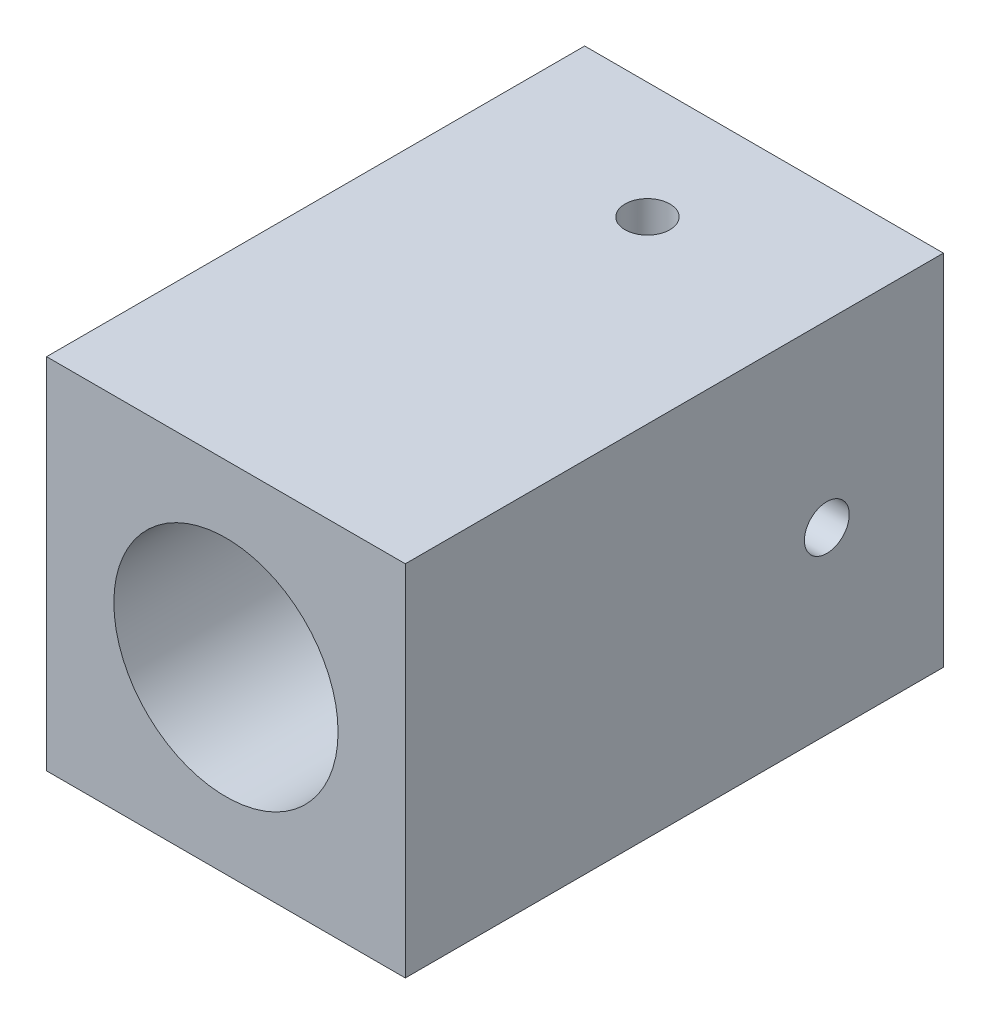
ISO-10303-21;
HEADER;
FILE_DESCRIPTION(('STEP AP214'),'2;1');
FILE_NAME('part.step','',(''),(''),'','','');
FILE_SCHEMA(('AUTOMOTIVE_DESIGN { 1 0 10303 214 1 1 1 1 }'));
ENDSEC;
DATA;
#1=APPLICATION_CONTEXT('core data for automotive mechanical design processes');
#2=APPLICATION_PROTOCOL_DEFINITION('international standard','automotive_design',2000,#1);
#3=PRODUCT_CONTEXT('',#1,'mechanical');
#4=PRODUCT('Part','Part','',(#3));
#5=PRODUCT_RELATED_PRODUCT_CATEGORY('part','',(#4));
#6=PRODUCT_DEFINITION_FORMATION('','',#4);
#7=PRODUCT_DEFINITION_CONTEXT('part definition',#1,'design');
#8=PRODUCT_DEFINITION('design','',#6,#7);
#9=PRODUCT_DEFINITION_SHAPE('','',#8);
#10=(LENGTH_UNIT() NAMED_UNIT(*) SI_UNIT(.MILLI.,.METRE.));
#11=(NAMED_UNIT(*) PLANE_ANGLE_UNIT() SI_UNIT($,.RADIAN.));
#12=(NAMED_UNIT(*) SI_UNIT($,.STERADIAN.) SOLID_ANGLE_UNIT());
#13=UNCERTAINTY_MEASURE_WITH_UNIT(LENGTH_MEASURE(1.E-05),#10,'distance_accuracy_value','');
#14=(GEOMETRIC_REPRESENTATION_CONTEXT(3) GLOBAL_UNCERTAINTY_ASSIGNED_CONTEXT((#13)) GLOBAL_UNIT_ASSIGNED_CONTEXT((#10,
#11,#12)) REPRESENTATION_CONTEXT('',''));
#15=CARTESIAN_POINT('',(0.,0.,0.));
#16=DIRECTION('',(0.,0.,1.));
#17=DIRECTION('',(1.,0.,0.));
#18=AXIS2_PLACEMENT_3D('',#15,#16,#17);
#19=CARTESIAN_POINT('',(20.,-20.,60.));
#20=DIRECTION('',(-1.,0.,0.));
#21=DIRECTION('',(0.,0.,1.));
#22=AXIS2_PLACEMENT_3D('',#19,#20,#21);
#23=PLANE('',#22);
#24=CARTESIAN_POINT('',(20.,0.,13.));
#25=DIRECTION('',(1.,0.,0.));
#26=DIRECTION('',(0.,0.,-1.));
#27=AXIS2_PLACEMENT_3D('',#24,#25,#26);
#28=CIRCLE('',#27,2.5);
#29=CARTESIAN_POINT('',(20.,0.,10.5));
#30=VERTEX_POINT('',#29);
#31=EDGE_CURVE('E141',#30,#30,#28,.T.);
#32=ORIENTED_EDGE('',*,*,#31,.F.);
#33=EDGE_LOOP('',(#32));
#34=FACE_BOUND('',#33,.T.);
#35=DIRECTION('',(0.,1.,0.));
#36=VECTOR('',#35,1.);
#37=CARTESIAN_POINT('',(20.,-20.,0.));
#38=LINE('',#37,#36);
#39=CARTESIAN_POINT('',(20.,-20.,0.));
#40=VERTEX_POINT('',#39);
#41=CARTESIAN_POINT('',(20.,20.,0.));
#42=VERTEX_POINT('',#41);
#43=EDGE_CURVE('E112',#40,#42,#38,.T.);
#44=ORIENTED_EDGE('',*,*,#43,.T.);
#45=DIRECTION('',(0.,0.,-1.));
#46=VECTOR('',#45,1.);
#47=CARTESIAN_POINT('',(20.,20.,60.));
#48=LINE('',#47,#46);
#49=CARTESIAN_POINT('',(20.,20.,60.));
#50=VERTEX_POINT('',#49);
#51=EDGE_CURVE('E11',#50,#42,#48,.T.);
#52=ORIENTED_EDGE('',*,*,#51,.F.);
#53=DIRECTION('',(0.,1.,0.));
#54=VECTOR('',#53,1.);
#55=CARTESIAN_POINT('',(20.,-20.,60.));
#56=LINE('',#55,#54);
#57=CARTESIAN_POINT('',(20.,-20.,60.));
#58=VERTEX_POINT('',#57);
#59=EDGE_CURVE('E96',#58,#50,#56,.T.);
#60=ORIENTED_EDGE('',*,*,#59,.F.);
#61=DIRECTION('',(0.,0.,-1.));
#62=VECTOR('',#61,1.);
#63=CARTESIAN_POINT('',(20.,-20.,60.));
#64=LINE('',#63,#62);
#65=EDGE_CURVE('E108',#58,#40,#64,.T.);
#66=ORIENTED_EDGE('',*,*,#65,.T.);
#67=EDGE_LOOP('',(#44,#52,#60,#66));
#68=FACE_BOUND('',#67,.T.);
#69=ADVANCED_FACE('F44',(#34,#68),#23,.F.);
#70=CARTESIAN_POINT('',(-20.,20.,60.));
#71=DIRECTION('',(0.,-1.,0.));
#72=DIRECTION('',(0.,0.,-1.));
#73=AXIS2_PLACEMENT_3D('',#70,#71,#72);
#74=PLANE('',#73);
#75=CARTESIAN_POINT('',(0.,20.,13.));
#76=DIRECTION('',(0.,-1.,0.));
#77=DIRECTION('',(0.,0.,-1.));
#78=AXIS2_PLACEMENT_3D('',#75,#76,#77);
#79=CIRCLE('',#78,2.5);
#80=CARTESIAN_POINT('',(0.,20.,10.5));
#81=VERTEX_POINT('',#80);
#82=EDGE_CURVE('E149',#81,#81,#79,.T.);
#83=ORIENTED_EDGE('',*,*,#82,.T.);
#84=EDGE_LOOP('',(#83));
#85=FACE_BOUND('',#84,.T.);
#86=DIRECTION('',(-1.,0.,0.));
#87=VECTOR('',#86,1.);
#88=CARTESIAN_POINT('',(-20.,20.,0.));
#89=LINE('',#88,#87);
#90=CARTESIAN_POINT('',(-20.,20.,0.));
#91=VERTEX_POINT('',#90);
#92=EDGE_CURVE('E101',#42,#91,#89,.T.);
#93=ORIENTED_EDGE('',*,*,#92,.T.);
#94=DIRECTION('',(0.,0.,-1.));
#95=VECTOR('',#94,1.);
#96=CARTESIAN_POINT('',(-20.,20.,60.));
#97=LINE('',#96,#95);
#98=CARTESIAN_POINT('',(-20.,20.,60.));
#99=VERTEX_POINT('',#98);
#100=EDGE_CURVE('E53',#99,#91,#97,.T.);
#101=ORIENTED_EDGE('',*,*,#100,.F.);
#102=DIRECTION('',(-1.,0.,0.));
#103=VECTOR('',#102,1.);
#104=CARTESIAN_POINT('',(-20.,20.,60.));
#105=LINE('',#104,#103);
#106=EDGE_CURVE('E91',#50,#99,#105,.T.);
#107=ORIENTED_EDGE('',*,*,#106,.F.);
#108=ORIENTED_EDGE('',*,*,#51,.T.);
#109=EDGE_LOOP('',(#93,#101,#107,#108));
#110=FACE_BOUND('',#109,.T.);
#111=ADVANCED_FACE('F100',(#85,#110),#74,.F.);
#112=CARTESIAN_POINT('',(-20.,-20.,60.));
#113=DIRECTION('',(1.,0.,0.));
#114=DIRECTION('',(0.,0.,-1.));
#115=AXIS2_PLACEMENT_3D('',#112,#113,#114);
#116=PLANE('',#115);
#117=CARTESIAN_POINT('',(-20.,0.,13.));
#118=DIRECTION('',(1.,0.,0.));
#119=DIRECTION('',(0.,0.,-1.));
#120=AXIS2_PLACEMENT_3D('',#117,#118,#119);
#121=CIRCLE('',#120,2.5);
#122=CARTESIAN_POINT('',(-20.,0.,10.5));
#123=VERTEX_POINT('',#122);
#124=EDGE_CURVE('E157',#123,#123,#121,.T.);
#125=ORIENTED_EDGE('',*,*,#124,.T.);
#126=EDGE_LOOP('',(#125));
#127=FACE_BOUND('',#126,.T.);
#128=DIRECTION('',(0.,-1.,0.));
#129=VECTOR('',#128,1.);
#130=CARTESIAN_POINT('',(-20.,-20.,0.));
#131=LINE('',#130,#129);
#132=CARTESIAN_POINT('',(-20.,-20.,0.));
#133=VERTEX_POINT('',#132);
#134=EDGE_CURVE('E78',#91,#133,#131,.T.);
#135=ORIENTED_EDGE('',*,*,#134,.T.);
#136=DIRECTION('',(0.,0.,-1.));
#137=VECTOR('',#136,1.);
#138=CARTESIAN_POINT('',(-20.,-20.,60.));
#139=LINE('',#138,#137);
#140=CARTESIAN_POINT('',(-20.,-20.,60.));
#141=VERTEX_POINT('',#140);
#142=EDGE_CURVE('E103',#141,#133,#139,.T.);
#143=ORIENTED_EDGE('',*,*,#142,.F.);
#144=DIRECTION('',(0.,-1.,0.));
#145=VECTOR('',#144,1.);
#146=CARTESIAN_POINT('',(-20.,-20.,60.));
#147=LINE('',#146,#145);
#148=EDGE_CURVE('E94',#99,#141,#147,.T.);
#149=ORIENTED_EDGE('',*,*,#148,.F.);
#150=ORIENTED_EDGE('',*,*,#100,.T.);
#151=EDGE_LOOP('',(#135,#143,#149,#150));
#152=FACE_BOUND('',#151,.T.);
#153=ADVANCED_FACE('F104',(#127,#152),#116,.F.);
#154=CARTESIAN_POINT('',(-20.,-20.,60.));
#155=DIRECTION('',(0.,1.,0.));
#156=DIRECTION('',(0.,0.,1.));
#157=AXIS2_PLACEMENT_3D('',#154,#155,#156);
#158=PLANE('',#157);
#159=CARTESIAN_POINT('',(0.,-20.,13.));
#160=DIRECTION('',(0.,-1.,0.));
#161=DIRECTION('',(0.,0.,-1.));
#162=AXIS2_PLACEMENT_3D('',#159,#160,#161);
#163=CIRCLE('',#162,2.5);
#164=CARTESIAN_POINT('',(0.,-20.,10.5));
#165=VERTEX_POINT('',#164);
#166=EDGE_CURVE('E133',#165,#165,#163,.T.);
#167=ORIENTED_EDGE('',*,*,#166,.F.);
#168=EDGE_LOOP('',(#167));
#169=FACE_BOUND('',#168,.T.);
#170=DIRECTION('',(1.,0.,0.));
#171=VECTOR('',#170,1.);
#172=CARTESIAN_POINT('',(-20.,-20.,0.));
#173=LINE('',#172,#171);
#174=EDGE_CURVE('E84',#133,#40,#173,.T.);
#175=ORIENTED_EDGE('',*,*,#174,.T.);
#176=ORIENTED_EDGE('',*,*,#65,.F.);
#177=DIRECTION('',(1.,0.,0.));
#178=VECTOR('',#177,1.);
#179=CARTESIAN_POINT('',(-20.,-20.,60.));
#180=LINE('',#179,#178);
#181=EDGE_CURVE('E61',#141,#58,#180,.T.);
#182=ORIENTED_EDGE('',*,*,#181,.F.);
#183=ORIENTED_EDGE('',*,*,#142,.T.);
#184=EDGE_LOOP('',(#175,#176,#182,#183));
#185=FACE_BOUND('',#184,.T.);
#186=ADVANCED_FACE('F126',(#169,#185),#158,.F.);
#187=CARTESIAN_POINT('',(0.,0.,60.));
#188=DIRECTION('',(0.,0.,-1.));
#189=DIRECTION('',(-1.,0.,0.));
#190=AXIS2_PLACEMENT_3D('',#187,#188,#189);
#191=PLANE('',#190);
#192=CARTESIAN_POINT('',(0.,0.,60.));
#193=DIRECTION('',(0.,0.,1.));
#194=DIRECTION('',(1.,0.,0.));
#195=AXIS2_PLACEMENT_3D('',#192,#193,#194);
#196=CIRCLE('',#195,12.5);
#197=CARTESIAN_POINT('',(12.5,0.,60.));
#198=VERTEX_POINT('',#197);
#199=EDGE_CURVE('E165',#198,#198,#196,.T.);
#200=ORIENTED_EDGE('',*,*,#199,.F.);
#201=EDGE_LOOP('',(#200));
#202=FACE_BOUND('',#201,.T.);
#203=ORIENTED_EDGE('',*,*,#59,.T.);
#204=ORIENTED_EDGE('',*,*,#106,.T.);
#205=ORIENTED_EDGE('',*,*,#148,.T.);
#206=ORIENTED_EDGE('',*,*,#181,.T.);
#207=EDGE_LOOP('',(#203,#204,#205,#206));
#208=FACE_BOUND('',#207,.T.);
#209=ADVANCED_FACE('F92',(#202,#208),#191,.F.);
#210=CARTESIAN_POINT('',(0.,0.,0.));
#211=DIRECTION('',(0.,0.,-1.));
#212=DIRECTION('',(-1.,0.,0.));
#213=AXIS2_PLACEMENT_3D('',#210,#211,#212);
#214=PLANE('',#213);
#215=ORIENTED_EDGE('',*,*,#43,.F.);
#216=ORIENTED_EDGE('',*,*,#174,.F.);
#217=ORIENTED_EDGE('',*,*,#134,.F.);
#218=ORIENTED_EDGE('',*,*,#92,.F.);
#219=EDGE_LOOP('',(#215,#216,#217,#218));
#220=FACE_BOUND('',#219,.T.);
#221=ADVANCED_FACE('F129',(#220),#214,.T.);
#222=CARTESIAN_POINT('',(0.,-10.,13.));
#223=DIRECTION('',(0.,-1.,0.));
#224=DIRECTION('',(0.,0.,-1.));
#225=AXIS2_PLACEMENT_3D('',#222,#223,#224);
#226=CYLINDRICAL_SURFACE('',#225,2.5);
#227=CARTESIAN_POINT('',(0.,-10.,13.));
#228=DIRECTION('',(0.,-1.,0.));
#229=DIRECTION('',(0.,0.,-1.));
#230=AXIS2_PLACEMENT_3D('',#227,#228,#229);
#231=CIRCLE('',#230,2.5);
#232=CARTESIAN_POINT('',(0.,-10.,10.5));
#233=VERTEX_POINT('',#232);
#234=EDGE_CURVE('E116',#233,#233,#231,.T.);
#235=ORIENTED_EDGE('',*,*,#234,.F.);
#236=EDGE_LOOP('',(#235));
#237=FACE_BOUND('',#236,.T.);
#238=ORIENTED_EDGE('',*,*,#166,.T.);
#239=EDGE_LOOP('',(#238));
#240=FACE_BOUND('',#239,.T.);
#241=ADVANCED_FACE('F188',(#237,#240),#226,.F.);
#242=CARTESIAN_POINT('',(0.,-10.,13.));
#243=DIRECTION('',(0.,-1.,0.));
#244=DIRECTION('',(0.,0.,-1.));
#245=AXIS2_PLACEMENT_3D('',#242,#243,#244);
#246=PLANE('',#245);
#247=ORIENTED_EDGE('',*,*,#234,.T.);
#248=EDGE_LOOP('',(#247));
#249=FACE_BOUND('',#248,.T.);
#250=ADVANCED_FACE('F206',(#249),#246,.T.);
#251=CARTESIAN_POINT('',(9.99999999999999,0.,13.));
#252=DIRECTION('',(1.,0.,0.));
#253=DIRECTION('',(0.,0.,-1.));
#254=AXIS2_PLACEMENT_3D('',#251,#252,#253);
#255=CYLINDRICAL_SURFACE('',#254,2.5);
#256=CARTESIAN_POINT('',(9.99999999999999,0.,13.));
#257=DIRECTION('',(1.,0.,0.));
#258=DIRECTION('',(0.,0.,-1.));
#259=AXIS2_PLACEMENT_3D('',#256,#257,#258);
#260=CIRCLE('',#259,2.5);
#261=CARTESIAN_POINT('',(9.99999999999999,0.,10.5));
#262=VERTEX_POINT('',#261);
#263=EDGE_CURVE('E137',#262,#262,#260,.T.);
#264=ORIENTED_EDGE('',*,*,#263,.F.);
#265=EDGE_LOOP('',(#264));
#266=FACE_BOUND('',#265,.T.);
#267=ORIENTED_EDGE('',*,*,#31,.T.);
#268=EDGE_LOOP('',(#267));
#269=FACE_BOUND('',#268,.T.);
#270=ADVANCED_FACE('F204',(#266,#269),#255,.F.);
#271=CARTESIAN_POINT('',(9.99999999999999,0.,13.));
#272=DIRECTION('',(1.,0.,0.));
#273=DIRECTION('',(0.,0.,-1.));
#274=AXIS2_PLACEMENT_3D('',#271,#272,#273);
#275=PLANE('',#274);
#276=ORIENTED_EDGE('',*,*,#263,.T.);
#277=EDGE_LOOP('',(#276));
#278=FACE_BOUND('',#277,.T.);
#279=ADVANCED_FACE('F205',(#278),#275,.T.);
#280=CARTESIAN_POINT('',(0.,10.,13.));
#281=DIRECTION('',(0.,1.,0.));
#282=DIRECTION('',(0.,0.,1.));
#283=AXIS2_PLACEMENT_3D('',#280,#281,#282);
#284=CYLINDRICAL_SURFACE('',#283,2.5);
#285=CARTESIAN_POINT('',(0.,10.,13.));
#286=DIRECTION('',(0.,-1.,0.));
#287=DIRECTION('',(0.,0.,-1.));
#288=AXIS2_PLACEMENT_3D('',#285,#286,#287);
#289=CIRCLE('',#288,2.5);
#290=CARTESIAN_POINT('',(0.,10.,10.5));
#291=VERTEX_POINT('',#290);
#292=EDGE_CURVE('E145',#291,#291,#289,.T.);
#293=ORIENTED_EDGE('',*,*,#292,.T.);
#294=EDGE_LOOP('',(#293));
#295=FACE_BOUND('',#294,.T.);
#296=ORIENTED_EDGE('',*,*,#82,.F.);
#297=EDGE_LOOP('',(#296));
#298=FACE_BOUND('',#297,.T.);
#299=ADVANCED_FACE('F212',(#295,#298),#284,.F.);
#300=CARTESIAN_POINT('',(0.,10.,13.));
#301=DIRECTION('',(0.,1.,0.));
#302=DIRECTION('',(0.,0.,-1.));
#303=AXIS2_PLACEMENT_3D('',#300,#301,#302);
#304=PLANE('',#303);
#305=ORIENTED_EDGE('',*,*,#292,.F.);
#306=EDGE_LOOP('',(#305));
#307=FACE_BOUND('',#306,.T.);
#308=ADVANCED_FACE('F254',(#307),#304,.T.);
#309=CARTESIAN_POINT('',(-9.99999999999999,0.,13.));
#310=DIRECTION('',(-1.,0.,0.));
#311=DIRECTION('',(0.,0.,1.));
#312=AXIS2_PLACEMENT_3D('',#309,#310,#311);
#313=CYLINDRICAL_SURFACE('',#312,2.5);
#314=CARTESIAN_POINT('',(-9.99999999999999,0.,13.));
#315=DIRECTION('',(1.,0.,0.));
#316=DIRECTION('',(0.,0.,-1.));
#317=AXIS2_PLACEMENT_3D('',#314,#315,#316);
#318=CIRCLE('',#317,2.5);
#319=CARTESIAN_POINT('',(-9.99999999999999,0.,10.5));
#320=VERTEX_POINT('',#319);
#321=EDGE_CURVE('E153',#320,#320,#318,.T.);
#322=ORIENTED_EDGE('',*,*,#321,.T.);
#323=EDGE_LOOP('',(#322));
#324=FACE_BOUND('',#323,.T.);
#325=ORIENTED_EDGE('',*,*,#124,.F.);
#326=EDGE_LOOP('',(#325));
#327=FACE_BOUND('',#326,.T.);
#328=ADVANCED_FACE('F263',(#324,#327),#313,.F.);
#329=CARTESIAN_POINT('',(-9.99999999999999,0.,13.));
#330=DIRECTION('',(-1.,0.,0.));
#331=DIRECTION('',(0.,0.,-1.));
#332=AXIS2_PLACEMENT_3D('',#329,#330,#331);
#333=PLANE('',#332);
#334=ORIENTED_EDGE('',*,*,#321,.F.);
#335=EDGE_LOOP('',(#334));
#336=FACE_BOUND('',#335,.T.);
#337=ADVANCED_FACE('F178',(#336),#333,.T.);
#338=CARTESIAN_POINT('',(0.,0.,20.));
#339=DIRECTION('',(0.,0.,1.));
#340=DIRECTION('',(1.,0.,0.));
#341=AXIS2_PLACEMENT_3D('',#338,#339,#340);
#342=CYLINDRICAL_SURFACE('',#341,12.5);
#343=CARTESIAN_POINT('',(0.,0.,20.));
#344=DIRECTION('',(0.,0.,1.));
#345=DIRECTION('',(1.,0.,0.));
#346=AXIS2_PLACEMENT_3D('',#343,#344,#345);
#347=CIRCLE('',#346,12.5);
#348=CARTESIAN_POINT('',(12.5,0.,20.));
#349=VERTEX_POINT('',#348);
#350=EDGE_CURVE('E161',#349,#349,#347,.T.);
#351=ORIENTED_EDGE('',*,*,#350,.F.);
#352=EDGE_LOOP('',(#351));
#353=FACE_BOUND('',#352,.T.);
#354=ORIENTED_EDGE('',*,*,#199,.T.);
#355=EDGE_LOOP('',(#354));
#356=FACE_BOUND('',#355,.T.);
#357=ADVANCED_FACE('F175',(#353,#356),#342,.F.);
#358=CARTESIAN_POINT('',(0.,0.,20.));
#359=DIRECTION('',(0.,0.,1.));
#360=DIRECTION('',(1.,0.,0.));
#361=AXIS2_PLACEMENT_3D('',#358,#359,#360);
#362=PLANE('',#361);
#363=ORIENTED_EDGE('',*,*,#350,.T.);
#364=EDGE_LOOP('',(#363));
#365=FACE_BOUND('',#364,.T.);
#366=ADVANCED_FACE('F173',(#365),#362,.T.);
#367=CLOSED_SHELL('',(#69,#111,#153,#186,#209,#221,#241,#250,#270,#279,#299,#308,#328,#337,#357,#366));
#368=MANIFOLD_SOLID_BREP('B2',#367);
#369=ADVANCED_BREP_SHAPE_REPRESENTATION('',(#18,#368),#14);
#370=SHAPE_DEFINITION_REPRESENTATION(#9,#369);
ENDSEC;
END-ISO-10303-21;
